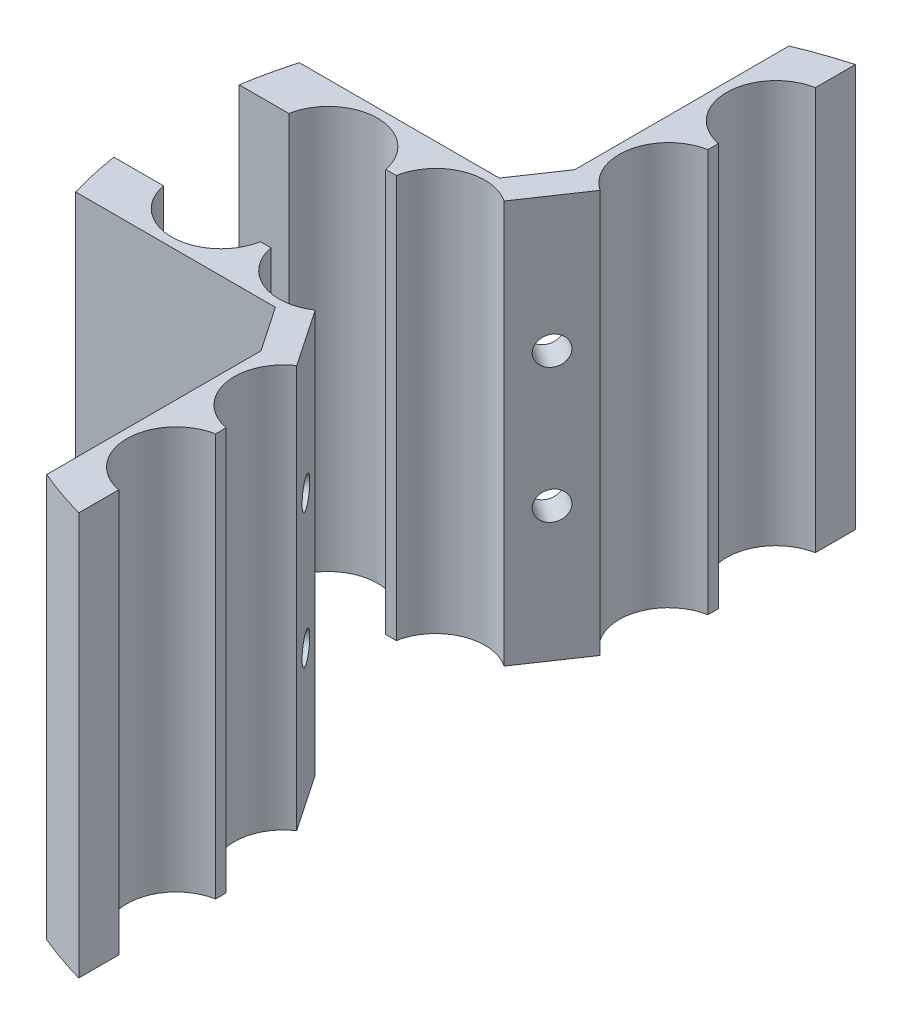
ISO-10303-21;
HEADER;
FILE_DESCRIPTION(('STEP AP214'),'2;1');
FILE_NAME('part.step','',(''),(''),'','','');
FILE_SCHEMA(('AUTOMOTIVE_DESIGN { 1 0 10303 214 1 1 1 1 }'));
ENDSEC;
DATA;
#1=APPLICATION_CONTEXT('core data for automotive mechanical design processes');
#2=APPLICATION_PROTOCOL_DEFINITION('international standard','automotive_design',2000,#1);
#3=PRODUCT_CONTEXT('',#1,'mechanical');
#4=PRODUCT('Part','Part','',(#3));
#5=PRODUCT_RELATED_PRODUCT_CATEGORY('part','',(#4));
#6=PRODUCT_DEFINITION_FORMATION('','',#4);
#7=PRODUCT_DEFINITION_CONTEXT('part definition',#1,'design');
#8=PRODUCT_DEFINITION('design','',#6,#7);
#9=PRODUCT_DEFINITION_SHAPE('','',#8);
#10=(LENGTH_UNIT() NAMED_UNIT(*) SI_UNIT(.MILLI.,.METRE.));
#11=(NAMED_UNIT(*) PLANE_ANGLE_UNIT() SI_UNIT($,.RADIAN.));
#12=(NAMED_UNIT(*) SI_UNIT($,.STERADIAN.) SOLID_ANGLE_UNIT());
#13=UNCERTAINTY_MEASURE_WITH_UNIT(LENGTH_MEASURE(1.E-05),#10,'distance_accuracy_value','');
#14=(GEOMETRIC_REPRESENTATION_CONTEXT(3) GLOBAL_UNCERTAINTY_ASSIGNED_CONTEXT((#13)) GLOBAL_UNIT_ASSIGNED_CONTEXT((#10,
#11,#12)) REPRESENTATION_CONTEXT('',''));
#15=CARTESIAN_POINT('',(0.,0.,0.));
#16=DIRECTION('',(0.,0.,1.));
#17=DIRECTION('',(1.,0.,0.));
#18=AXIS2_PLACEMENT_3D('',#15,#16,#17);
#19=CARTESIAN_POINT('',(0.,45.,0.));
#20=DIRECTION('',(0.,-1.,0.));
#21=DIRECTION('',(0.,0.,-1.));
#22=AXIS2_PLACEMENT_3D('',#19,#20,#21);
#23=CYLINDRICAL_SURFACE('',#22,45.);
#24=DIRECTION('',(0.,1.,0.));
#25=VECTOR('',#24,1.);
#26=CARTESIAN_POINT('',(-43.2290411644765,0.,12.5));
#27=LINE('',#26,#25);
#28=CARTESIAN_POINT('',(-43.2290411644765,0.,12.5));
#29=VERTEX_POINT('',#28);
#30=CARTESIAN_POINT('',(-43.2290411644765,45.,12.5));
#31=VERTEX_POINT('',#30);
#32=EDGE_CURVE('E199',#29,#31,#27,.T.);
#33=ORIENTED_EDGE('',*,*,#32,.T.);
#34=CARTESIAN_POINT('',(0.,45.,0.));
#35=DIRECTION('',(0.,1.,0.));
#36=DIRECTION('',(0.,0.,1.));
#37=AXIS2_PLACEMENT_3D('',#34,#35,#36);
#38=CIRCLE('',#37,45.);
#39=CARTESIAN_POINT('',(-44.4522215417857,45.,7.));
#40=VERTEX_POINT('',#39);
#41=EDGE_CURVE('E380',#40,#31,#38,.T.);
#42=ORIENTED_EDGE('',*,*,#41,.F.);
#43=DIRECTION('',(0.,-1.,0.));
#44=VECTOR('',#43,1.);
#45=CARTESIAN_POINT('',(-44.4522215417857,45.,6.99999999999999));
#46=LINE('',#45,#44);
#47=CARTESIAN_POINT('',(-44.4522215417857,0.,7.));
#48=VERTEX_POINT('',#47);
#49=EDGE_CURVE('E343',#48,#40,#46,.F.);
#50=ORIENTED_EDGE('',*,*,#49,.F.);
#51=CARTESIAN_POINT('',(0.,0.,0.));
#52=DIRECTION('',(0.,1.,0.));
#53=DIRECTION('',(0.,0.,1.));
#54=AXIS2_PLACEMENT_3D('',#51,#52,#53);
#55=CIRCLE('',#54,45.);
#56=EDGE_CURVE('E384',#48,#29,#55,.T.);
#57=ORIENTED_EDGE('',*,*,#56,.T.);
#58=EDGE_LOOP('',(#33,#42,#50,#57));
#59=FACE_BOUND('',#58,.T.);
#60=ADVANCED_FACE('F182',(#59),#23,.T.);
#61=CARTESIAN_POINT('',(0.,45.,0.));
#62=DIRECTION('',(0.,1.,0.));
#63=DIRECTION('',(0.,0.,1.));
#64=AXIS2_PLACEMENT_3D('',#61,#62,#63);
#65=PLANE('',#64);
#66=DIRECTION('',(0.56083647376651,0.,0.827926596802607));
#67=VECTOR('',#66,1.);
#68=CARTESIAN_POINT('',(-20.1360275526129,45.,13.6401206723948));
#69=LINE('',#68,#67);
#70=CARTESIAN_POINT('',(-20.9083439150097,45.,12.5));
#71=VERTEX_POINT('',#70);
#72=CARTESIAN_POINT('',(-17.5,45.,17.5315175818284));
#73=VERTEX_POINT('',#72);
#74=EDGE_CURVE('E299',#71,#73,#69,.T.);
#75=ORIENTED_EDGE('',*,*,#74,.T.);
#76=DIRECTION('',(0.,0.,1.));
#77=VECTOR('',#76,1.);
#78=CARTESIAN_POINT('',(-17.5,45.,0.));
#79=LINE('',#78,#77);
#80=CARTESIAN_POINT('',(-17.5,45.,41.4578098794425));
#81=VERTEX_POINT('',#80);
#82=EDGE_CURVE('E305',#73,#81,#79,.T.);
#83=ORIENTED_EDGE('',*,*,#82,.T.);
#84=CARTESIAN_POINT('',(-12.,45.,43.3704968844029));
#85=VERTEX_POINT('',#84);
#86=EDGE_CURVE('E383',#81,#85,#38,.T.);
#87=ORIENTED_EDGE('',*,*,#86,.T.);
#88=DIRECTION('',(0.,0.,1.));
#89=VECTOR('',#88,1.);
#90=CARTESIAN_POINT('',(-12.,45.,6.));
#91=LINE('',#90,#89);
#92=CARTESIAN_POINT('',(-12.,45.,38.908326913196));
#93=VERTEX_POINT('',#92);
#94=EDGE_CURVE('E334',#93,#85,#91,.T.);
#95=ORIENTED_EDGE('',*,*,#94,.F.);
#96=CARTESIAN_POINT('',(-11.,45.,33.5));
#97=DIRECTION('',(0.,1.,0.));
#98=DIRECTION('',(0.,0.,1.));
#99=AXIS2_PLACEMENT_3D('',#96,#97,#98);
#100=CIRCLE('',#99,5.5);
#101=CARTESIAN_POINT('',(-12.,45.,28.091673086804));
#102=VERTEX_POINT('',#101);
#103=EDGE_CURVE('E358',#102,#93,#100,.T.);
#104=ORIENTED_EDGE('',*,*,#103,.F.);
#105=CARTESIAN_POINT('',(-12.,45.,26.908326913196));
#106=VERTEX_POINT('',#105);
#107=EDGE_CURVE('E207',#106,#102,#91,.T.);
#108=ORIENTED_EDGE('',*,*,#107,.F.);
#109=CARTESIAN_POINT('',(-11.,45.,21.5));
#110=DIRECTION('',(0.,1.,0.));
#111=DIRECTION('',(0.,0.,1.));
#112=AXIS2_PLACEMENT_3D('',#109,#110,#111);
#113=CIRCLE('',#112,5.5);
#114=CARTESIAN_POINT('',(-14.0846647984323,45.,16.9464472023142));
#115=VERTEX_POINT('',#114);
#116=EDGE_CURVE('E355',#115,#106,#113,.T.);
#117=ORIENTED_EDGE('',*,*,#116,.F.);
#118=DIRECTION('',(0.560848145169515,0.,0.827918690488332));
#119=VECTOR('',#118,1.);
#120=CARTESIAN_POINT('',(-21.5,45.,6.));
#121=LINE('',#120,#119);
#122=CARTESIAN_POINT('',(-18.4153352015677,45.,10.5535527976858));
#123=VERTEX_POINT('',#122);
#124=EDGE_CURVE('E319',#123,#115,#121,.T.);
#125=ORIENTED_EDGE('',*,*,#124,.F.);
#126=CARTESIAN_POINT('',(-21.5,45.,6.));
#127=DIRECTION('',(0.,1.,0.));
#128=DIRECTION('',(0.,0.,1.));
#129=AXIS2_PLACEMENT_3D('',#126,#127,#128);
#130=CIRCLE('',#129,5.5);
#131=CARTESIAN_POINT('',(-26.908326913196,45.,7.));
#132=VERTEX_POINT('',#131);
#133=EDGE_CURVE('E364',#132,#123,#130,.T.);
#134=ORIENTED_EDGE('',*,*,#133,.F.);
#135=DIRECTION('',(-1.,0.,0.));
#136=VECTOR('',#135,1.);
#137=CARTESIAN_POINT('',(-11.,45.,7.));
#138=LINE('',#137,#136);
#139=CARTESIAN_POINT('',(-28.091673086804,45.,7.));
#140=VERTEX_POINT('',#139);
#141=EDGE_CURVE('E326',#132,#140,#138,.T.);
#142=ORIENTED_EDGE('',*,*,#141,.T.);
#143=CARTESIAN_POINT('',(-33.5,45.,6.));
#144=DIRECTION('',(0.,1.,0.));
#145=DIRECTION('',(0.,0.,1.));
#146=AXIS2_PLACEMENT_3D('',#143,#144,#145);
#147=CIRCLE('',#146,5.5);
#148=CARTESIAN_POINT('',(-38.908326913196,45.,7.));
#149=VERTEX_POINT('',#148);
#150=EDGE_CURVE('E367',#149,#140,#147,.T.);
#151=ORIENTED_EDGE('',*,*,#150,.F.);
#152=EDGE_CURVE('E327',#149,#40,#138,.T.);
#153=ORIENTED_EDGE('',*,*,#152,.T.);
#154=ORIENTED_EDGE('',*,*,#41,.T.);
#155=DIRECTION('',(1.,0.,0.));
#156=VECTOR('',#155,1.);
#157=CARTESIAN_POINT('',(0.,45.,12.5));
#158=LINE('',#157,#156);
#159=EDGE_CURVE('E308',#31,#71,#158,.T.);
#160=ORIENTED_EDGE('',*,*,#159,.T.);
#161=EDGE_LOOP('',(#75,#83,#87,#95,#104,#108,#117,#125,#134,#142,#151,#153,#154,#160));
#162=FACE_BOUND('',#161,.T.);
#163=ADVANCED_FACE('F432',(#162),#65,.T.);
#164=CARTESIAN_POINT('',(0.,0.,0.));
#165=DIRECTION('',(0.,1.,0.));
#166=DIRECTION('',(0.,0.,1.));
#167=AXIS2_PLACEMENT_3D('',#164,#165,#166);
#168=PLANE('',#167);
#169=DIRECTION('',(0.,0.,1.));
#170=VECTOR('',#169,1.);
#171=CARTESIAN_POINT('',(-17.5,0.,0.));
#172=LINE('',#171,#170);
#173=CARTESIAN_POINT('',(-17.5,0.,17.5315175818284));
#174=VERTEX_POINT('',#173);
#175=CARTESIAN_POINT('',(-17.5,0.,41.4578098794425));
#176=VERTEX_POINT('',#175);
#177=EDGE_CURVE('E291',#174,#176,#172,.T.);
#178=ORIENTED_EDGE('',*,*,#177,.F.);
#179=DIRECTION('',(0.56083647376651,0.,0.827926596802607));
#180=VECTOR('',#179,1.);
#181=CARTESIAN_POINT('',(-20.1360275526129,0.,13.6401206723948));
#182=LINE('',#181,#180);
#183=CARTESIAN_POINT('',(-20.9083439150097,0.,12.5));
#184=VERTEX_POINT('',#183);
#185=EDGE_CURVE('E292',#184,#174,#182,.T.);
#186=ORIENTED_EDGE('',*,*,#185,.F.);
#187=DIRECTION('',(1.,0.,0.));
#188=VECTOR('',#187,1.);
#189=CARTESIAN_POINT('',(0.,0.,12.5));
#190=LINE('',#189,#188);
#191=EDGE_CURVE('E282',#29,#184,#190,.T.);
#192=ORIENTED_EDGE('',*,*,#191,.F.);
#193=ORIENTED_EDGE('',*,*,#56,.F.);
#194=DIRECTION('',(-1.,0.,0.));
#195=VECTOR('',#194,1.);
#196=CARTESIAN_POINT('',(-11.,0.,7.));
#197=LINE('',#196,#195);
#198=CARTESIAN_POINT('',(-38.908326913196,0.,7.));
#199=VERTEX_POINT('',#198);
#200=EDGE_CURVE('E323',#199,#48,#197,.T.);
#201=ORIENTED_EDGE('',*,*,#200,.F.);
#202=CARTESIAN_POINT('',(-33.5,0.,6.));
#203=DIRECTION('',(0.,1.,0.));
#204=DIRECTION('',(0.,0.,1.));
#205=AXIS2_PLACEMENT_3D('',#202,#203,#204);
#206=CIRCLE('',#205,5.5);
#207=CARTESIAN_POINT('',(-28.091673086804,0.,7.));
#208=VERTEX_POINT('',#207);
#209=EDGE_CURVE('E370',#199,#208,#206,.T.);
#210=ORIENTED_EDGE('',*,*,#209,.T.);
#211=CARTESIAN_POINT('',(-26.908326913196,0.,7.));
#212=VERTEX_POINT('',#211);
#213=EDGE_CURVE('E325',#212,#208,#197,.T.);
#214=ORIENTED_EDGE('',*,*,#213,.F.);
#215=CARTESIAN_POINT('',(-21.5,0.,6.));
#216=DIRECTION('',(0.,1.,0.));
#217=DIRECTION('',(0.,0.,1.));
#218=AXIS2_PLACEMENT_3D('',#215,#216,#217);
#219=CIRCLE('',#218,5.5);
#220=CARTESIAN_POINT('',(-18.4153352015677,0.,10.5535527976858));
#221=VERTEX_POINT('',#220);
#222=EDGE_CURVE('E363',#212,#221,#219,.T.);
#223=ORIENTED_EDGE('',*,*,#222,.T.);
#224=DIRECTION('',(0.560848145169515,0.,0.827918690488332));
#225=VECTOR('',#224,1.);
#226=CARTESIAN_POINT('',(-21.5,0.,6.));
#227=LINE('',#226,#225);
#228=CARTESIAN_POINT('',(-14.0846647984323,0.,16.9464472023142));
#229=VERTEX_POINT('',#228);
#230=EDGE_CURVE('E337',#221,#229,#227,.T.);
#231=ORIENTED_EDGE('',*,*,#230,.T.);
#232=CARTESIAN_POINT('',(-11.,0.,21.5));
#233=DIRECTION('',(0.,1.,0.));
#234=DIRECTION('',(0.,0.,1.));
#235=AXIS2_PLACEMENT_3D('',#232,#233,#234);
#236=CIRCLE('',#235,5.5);
#237=CARTESIAN_POINT('',(-12.,0.,26.908326913196));
#238=VERTEX_POINT('',#237);
#239=EDGE_CURVE('E360',#229,#238,#236,.T.);
#240=ORIENTED_EDGE('',*,*,#239,.T.);
#241=DIRECTION('',(0.,0.,1.));
#242=VECTOR('',#241,1.);
#243=CARTESIAN_POINT('',(-12.,0.,6.));
#244=LINE('',#243,#242);
#245=CARTESIAN_POINT('',(-12.,0.,28.091673086804));
#246=VERTEX_POINT('',#245);
#247=EDGE_CURVE('E330',#238,#246,#244,.T.);
#248=ORIENTED_EDGE('',*,*,#247,.T.);
#249=CARTESIAN_POINT('',(-11.,0.,33.5));
#250=DIRECTION('',(0.,1.,0.));
#251=DIRECTION('',(0.,0.,1.));
#252=AXIS2_PLACEMENT_3D('',#249,#250,#251);
#253=CIRCLE('',#252,5.5);
#254=CARTESIAN_POINT('',(-12.,0.,38.908326913196));
#255=VERTEX_POINT('',#254);
#256=EDGE_CURVE('E359',#246,#255,#253,.T.);
#257=ORIENTED_EDGE('',*,*,#256,.T.);
#258=CARTESIAN_POINT('',(-12.,0.,43.3704968844029));
#259=VERTEX_POINT('',#258);
#260=EDGE_CURVE('E331',#255,#259,#244,.T.);
#261=ORIENTED_EDGE('',*,*,#260,.T.);
#262=EDGE_CURVE('E354',#176,#259,#55,.T.);
#263=ORIENTED_EDGE('',*,*,#262,.F.);
#264=EDGE_LOOP('',(#178,#186,#192,#193,#201,#210,#214,#223,#231,#240,#248,#257,#261,#263));
#265=FACE_BOUND('',#264,.T.);
#266=ADVANCED_FACE('F303',(#265),#168,.F.);
#267=ORIENTED_EDGE('',*,*,#86,.F.);
#268=DIRECTION('',(0.,1.,0.));
#269=VECTOR('',#268,1.);
#270=CARTESIAN_POINT('',(-17.5,0.,41.4578098794425));
#271=LINE('',#270,#269);
#272=EDGE_CURVE('E320',#176,#81,#271,.T.);
#273=ORIENTED_EDGE('',*,*,#272,.F.);
#274=ORIENTED_EDGE('',*,*,#262,.T.);
#275=DIRECTION('',(0.,-1.,0.));
#276=VECTOR('',#275,1.);
#277=CARTESIAN_POINT('',(-12.,45.,43.3704968844029));
#278=LINE('',#277,#276);
#279=EDGE_CURVE('E351',#259,#85,#278,.F.);
#280=ORIENTED_EDGE('',*,*,#279,.T.);
#281=EDGE_LOOP('',(#267,#273,#274,#280));
#282=FACE_BOUND('',#281,.T.);
#283=ADVANCED_FACE('F184',(#282),#23,.T.);
#284=CARTESIAN_POINT('',(-21.5,0.,6.));
#285=DIRECTION('',(0.,1.,0.));
#286=DIRECTION('',(0.,0.,1.));
#287=AXIS2_PLACEMENT_3D('',#284,#285,#286);
#288=CYLINDRICAL_SURFACE('',#287,5.5);
#289=DIRECTION('',(0.,1.,0.));
#290=VECTOR('',#289,1.);
#291=CARTESIAN_POINT('',(-26.908326913196,0.,7.));
#292=LINE('',#291,#290);
#293=EDGE_CURVE('E341',#132,#212,#292,.F.);
#294=ORIENTED_EDGE('',*,*,#293,.F.);
#295=ORIENTED_EDGE('',*,*,#133,.T.);
#296=DIRECTION('',(0.,1.,0.));
#297=VECTOR('',#296,1.);
#298=CARTESIAN_POINT('',(-18.4153352015677,0.,10.5535527976858));
#299=LINE('',#298,#297);
#300=EDGE_CURVE('E389',#123,#221,#299,.F.);
#301=ORIENTED_EDGE('',*,*,#300,.T.);
#302=ORIENTED_EDGE('',*,*,#222,.F.);
#303=EDGE_LOOP('',(#294,#295,#301,#302));
#304=FACE_BOUND('',#303,.T.);
#305=ADVANCED_FACE('F418',(#304),#288,.F.);
#306=CARTESIAN_POINT('',(-33.5,0.,6.));
#307=DIRECTION('',(0.,1.,0.));
#308=DIRECTION('',(0.,0.,1.));
#309=AXIS2_PLACEMENT_3D('',#306,#307,#308);
#310=CYLINDRICAL_SURFACE('',#309,5.5);
#311=DIRECTION('',(0.,1.,0.));
#312=VECTOR('',#311,1.);
#313=CARTESIAN_POINT('',(-38.908326913196,0.,7.));
#314=LINE('',#313,#312);
#315=EDGE_CURVE('E387',#149,#199,#314,.F.);
#316=ORIENTED_EDGE('',*,*,#315,.F.);
#317=ORIENTED_EDGE('',*,*,#150,.T.);
#318=DIRECTION('',(0.,1.,0.));
#319=VECTOR('',#318,1.);
#320=CARTESIAN_POINT('',(-28.091673086804,0.,7.));
#321=LINE('',#320,#319);
#322=EDGE_CURVE('E377',#208,#140,#321,.T.);
#323=ORIENTED_EDGE('',*,*,#322,.F.);
#324=ORIENTED_EDGE('',*,*,#209,.F.);
#325=EDGE_LOOP('',(#316,#317,#323,#324));
#326=FACE_BOUND('',#325,.T.);
#327=ADVANCED_FACE('F429',(#326),#310,.F.);
#328=CARTESIAN_POINT('',(-11.,0.,21.5));
#329=DIRECTION('',(0.,1.,0.));
#330=DIRECTION('',(0.,0.,1.));
#331=AXIS2_PLACEMENT_3D('',#328,#329,#330);
#332=CYLINDRICAL_SURFACE('',#331,5.5);
#333=ORIENTED_EDGE('',*,*,#116,.T.);
#334=DIRECTION('',(0.,1.,0.));
#335=VECTOR('',#334,1.);
#336=CARTESIAN_POINT('',(-12.,0.,26.908326913196));
#337=LINE('',#336,#335);
#338=EDGE_CURVE('E348',#106,#238,#337,.F.);
#339=ORIENTED_EDGE('',*,*,#338,.T.);
#340=ORIENTED_EDGE('',*,*,#239,.F.);
#341=DIRECTION('',(0.,1.,0.));
#342=VECTOR('',#341,1.);
#343=CARTESIAN_POINT('',(-14.0846647984323,0.,16.9464472023142));
#344=LINE('',#343,#342);
#345=EDGE_CURVE('E345',#229,#115,#344,.T.);
#346=ORIENTED_EDGE('',*,*,#345,.T.);
#347=EDGE_LOOP('',(#333,#339,#340,#346));
#348=FACE_BOUND('',#347,.T.);
#349=ADVANCED_FACE('F436',(#348),#332,.F.);
#350=CARTESIAN_POINT('',(-11.,0.,33.5));
#351=DIRECTION('',(0.,1.,0.));
#352=DIRECTION('',(0.,0.,1.));
#353=AXIS2_PLACEMENT_3D('',#350,#351,#352);
#354=CYLINDRICAL_SURFACE('',#353,5.5);
#355=ORIENTED_EDGE('',*,*,#103,.T.);
#356=DIRECTION('',(0.,1.,0.));
#357=VECTOR('',#356,1.);
#358=CARTESIAN_POINT('',(-12.,0.,38.908326913196));
#359=LINE('',#358,#357);
#360=EDGE_CURVE('E13',#93,#255,#359,.F.);
#361=ORIENTED_EDGE('',*,*,#360,.T.);
#362=ORIENTED_EDGE('',*,*,#256,.F.);
#363=DIRECTION('',(0.,1.,0.));
#364=VECTOR('',#363,1.);
#365=CARTESIAN_POINT('',(-12.,0.,28.091673086804));
#366=LINE('',#365,#364);
#367=EDGE_CURVE('E191',#246,#102,#366,.T.);
#368=ORIENTED_EDGE('',*,*,#367,.T.);
#369=EDGE_LOOP('',(#355,#361,#362,#368));
#370=FACE_BOUND('',#369,.T.);
#371=ADVANCED_FACE('F440',(#370),#354,.F.);
#372=CARTESIAN_POINT('',(-11.,0.,7.));
#373=DIRECTION('',(0.,0.,-1.));
#374=DIRECTION('',(-1.,0.,0.));
#375=AXIS2_PLACEMENT_3D('',#372,#373,#374);
#376=PLANE('',#375);
#377=ORIENTED_EDGE('',*,*,#293,.T.);
#378=ORIENTED_EDGE('',*,*,#213,.T.);
#379=ORIENTED_EDGE('',*,*,#322,.T.);
#380=ORIENTED_EDGE('',*,*,#141,.F.);
#381=EDGE_LOOP('',(#377,#378,#379,#380));
#382=FACE_BOUND('',#381,.T.);
#383=ADVANCED_FACE('F425',(#382),#376,.T.);
#384=ORIENTED_EDGE('',*,*,#49,.T.);
#385=ORIENTED_EDGE('',*,*,#152,.F.);
#386=ORIENTED_EDGE('',*,*,#315,.T.);
#387=ORIENTED_EDGE('',*,*,#200,.T.);
#388=EDGE_LOOP('',(#384,#385,#386,#387));
#389=FACE_BOUND('',#388,.T.);
#390=ADVANCED_FACE('F410',(#389),#376,.T.);
#391=CARTESIAN_POINT('',(-21.5,0.,6.));
#392=DIRECTION('',(-0.827918690488332,0.,0.560848145169515));
#393=DIRECTION('',(0.560848145169515,0.,0.827918690488332));
#394=AXIS2_PLACEMENT_3D('',#391,#392,#393);
#395=PLANE('',#394);
#396=CARTESIAN_POINT('',(-16.25,30.,13.75));
#397=DIRECTION('',(0.827918690488332,0.,-0.560848145169515));
#398=DIRECTION('',(-0.560848145169515,0.,-0.827918690488332));
#399=AXIS2_PLACEMENT_3D('',#396,#397,#398);
#400=CIRCLE('',#399,1.6);
#401=CARTESIAN_POINT('',(-17.1473570322712,30.,12.4253300952187));
#402=VERTEX_POINT('',#401);
#403=EDGE_CURVE('E394',#402,#402,#400,.T.);
#404=ORIENTED_EDGE('',*,*,#403,.F.);
#405=EDGE_LOOP('',(#404));
#406=FACE_BOUND('',#405,.T.);
#407=CARTESIAN_POINT('',(-16.25,15.,13.75));
#408=DIRECTION('',(0.827918690488332,0.,-0.560848145169515));
#409=DIRECTION('',(-0.560848145169515,0.,-0.827918690488332));
#410=AXIS2_PLACEMENT_3D('',#407,#408,#409);
#411=CIRCLE('',#410,1.6);
#412=CARTESIAN_POINT('',(-17.1473570322712,15.,12.4253300952187));
#413=VERTEX_POINT('',#412);
#414=EDGE_CURVE('E311',#413,#413,#411,.T.);
#415=ORIENTED_EDGE('',*,*,#414,.F.);
#416=EDGE_LOOP('',(#415));
#417=FACE_BOUND('',#416,.T.);
#418=ORIENTED_EDGE('',*,*,#230,.F.);
#419=ORIENTED_EDGE('',*,*,#300,.F.);
#420=ORIENTED_EDGE('',*,*,#124,.T.);
#421=ORIENTED_EDGE('',*,*,#345,.F.);
#422=EDGE_LOOP('',(#418,#419,#420,#421));
#423=FACE_BOUND('',#422,.T.);
#424=ADVANCED_FACE('F406',(#406,#417,#423),#395,.F.);
#425=CARTESIAN_POINT('',(-12.,0.,6.));
#426=DIRECTION('',(-1.,0.,0.));
#427=DIRECTION('',(0.,0.,1.));
#428=AXIS2_PLACEMENT_3D('',#425,#426,#427);
#429=PLANE('',#428);
#430=ORIENTED_EDGE('',*,*,#107,.T.);
#431=ORIENTED_EDGE('',*,*,#367,.F.);
#432=ORIENTED_EDGE('',*,*,#247,.F.);
#433=ORIENTED_EDGE('',*,*,#338,.F.);
#434=EDGE_LOOP('',(#430,#431,#432,#433));
#435=FACE_BOUND('',#434,.T.);
#436=ADVANCED_FACE('F409',(#435),#429,.F.);
#437=ORIENTED_EDGE('',*,*,#260,.F.);
#438=ORIENTED_EDGE('',*,*,#360,.F.);
#439=ORIENTED_EDGE('',*,*,#94,.T.);
#440=ORIENTED_EDGE('',*,*,#279,.F.);
#441=EDGE_LOOP('',(#437,#438,#439,#440));
#442=FACE_BOUND('',#441,.T.);
#443=ADVANCED_FACE('F444',(#442),#429,.F.);
#444=CARTESIAN_POINT('',(-20.1360275526129,0.,13.6401206723948));
#445=DIRECTION('',(-0.827926596802607,0.,0.56083647376651));
#446=DIRECTION('',(0.56083647376651,0.,0.827926596802607));
#447=AXIS2_PLACEMENT_3D('',#444,#445,#446);
#448=PLANE('',#447);
#449=CARTESIAN_POINT('',(-18.8626805902712,30.,15.5198803998611));
#450=DIRECTION('',(-0.827926596802607,0.,0.56083647376651));
#451=DIRECTION('',(-0.56083647376651,0.,-0.827926596802607));
#452=AXIS2_PLACEMENT_3D('',#449,#450,#451);
#453=ELLIPSE('',#452,1.60000000015899,1.6);
#454=CARTESIAN_POINT('',(-19.7600189483867,30.,14.1951978448453));
#455=VERTEX_POINT('',#454);
#456=EDGE_CURVE('E186',#455,#455,#453,.T.);
#457=ORIENTED_EDGE('',*,*,#456,.F.);
#458=EDGE_LOOP('',(#457));
#459=FACE_BOUND('',#458,.T.);
#460=CARTESIAN_POINT('',(-18.8626805902712,15.,15.5198803998611));
#461=DIRECTION('',(-0.827926596802607,0.,0.56083647376651));
#462=DIRECTION('',(-0.56083647376651,0.,-0.827926596802607));
#463=AXIS2_PLACEMENT_3D('',#460,#461,#462);
#464=ELLIPSE('',#463,1.60000000015899,1.6);
#465=CARTESIAN_POINT('',(-19.7600189483867,15.,14.1951978448453));
#466=VERTEX_POINT('',#465);
#467=EDGE_CURVE('E392',#466,#466,#464,.T.);
#468=ORIENTED_EDGE('',*,*,#467,.F.);
#469=EDGE_LOOP('',(#468));
#470=FACE_BOUND('',#469,.T.);
#471=ORIENTED_EDGE('',*,*,#74,.F.);
#472=DIRECTION('',(0.,1.,0.));
#473=VECTOR('',#472,1.);
#474=CARTESIAN_POINT('',(-20.9083439150097,0.,12.5));
#475=LINE('',#474,#473);
#476=EDGE_CURVE('E285',#184,#71,#475,.T.);
#477=ORIENTED_EDGE('',*,*,#476,.F.);
#478=ORIENTED_EDGE('',*,*,#185,.T.);
#479=DIRECTION('',(0.,1.,0.));
#480=VECTOR('',#479,1.);
#481=CARTESIAN_POINT('',(-17.5,0.,17.5315175818284));
#482=LINE('',#481,#480);
#483=EDGE_CURVE('E317',#174,#73,#482,.T.);
#484=ORIENTED_EDGE('',*,*,#483,.T.);
#485=EDGE_LOOP('',(#471,#477,#478,#484));
#486=FACE_BOUND('',#485,.T.);
#487=ADVANCED_FACE('F295',(#459,#470,#486),#448,.T.);
#488=CARTESIAN_POINT('',(-17.5,0.,0.));
#489=DIRECTION('',(-1.,0.,0.));
#490=DIRECTION('',(0.,0.,1.));
#491=AXIS2_PLACEMENT_3D('',#488,#489,#490);
#492=PLANE('',#491);
#493=ORIENTED_EDGE('',*,*,#82,.F.);
#494=ORIENTED_EDGE('',*,*,#483,.F.);
#495=ORIENTED_EDGE('',*,*,#177,.T.);
#496=ORIENTED_EDGE('',*,*,#272,.T.);
#497=EDGE_LOOP('',(#493,#494,#495,#496));
#498=FACE_BOUND('',#497,.T.);
#499=ADVANCED_FACE('F450',(#498),#492,.T.);
#500=CARTESIAN_POINT('',(0.,0.,12.5));
#501=DIRECTION('',(0.,0.,1.));
#502=DIRECTION('',(1.,0.,0.));
#503=AXIS2_PLACEMENT_3D('',#500,#501,#502);
#504=PLANE('',#503);
#505=ORIENTED_EDGE('',*,*,#159,.F.);
#506=ORIENTED_EDGE('',*,*,#32,.F.);
#507=ORIENTED_EDGE('',*,*,#191,.T.);
#508=ORIENTED_EDGE('',*,*,#476,.T.);
#509=EDGE_LOOP('',(#505,#506,#507,#508));
#510=FACE_BOUND('',#509,.T.);
#511=ADVANCED_FACE('F284',(#510),#504,.T.);
#512=CARTESIAN_POINT('',(-53.5063410719749,15.,38.9881665326282));
#513=DIRECTION('',(0.827918690488332,0.,-0.560848145169515));
#514=DIRECTION('',(-0.560848145169515,0.,-0.827918690488332));
#515=AXIS2_PLACEMENT_3D('',#512,#513,#514);
#516=CYLINDRICAL_SURFACE('',#515,1.6);
#517=ORIENTED_EDGE('',*,*,#467,.T.);
#518=EDGE_LOOP('',(#517));
#519=FACE_BOUND('',#518,.T.);
#520=ORIENTED_EDGE('',*,*,#414,.T.);
#521=EDGE_LOOP('',(#520));
#522=FACE_BOUND('',#521,.T.);
#523=ADVANCED_FACE('F404',(#519,#522),#516,.F.);
#524=CARTESIAN_POINT('',(-53.5063410719749,30.,38.9881665326282));
#525=DIRECTION('',(0.827918690488332,0.,-0.560848145169515));
#526=DIRECTION('',(-0.560848145169515,0.,-0.827918690488332));
#527=AXIS2_PLACEMENT_3D('',#524,#525,#526);
#528=CYLINDRICAL_SURFACE('',#527,1.6);
#529=ORIENTED_EDGE('',*,*,#456,.T.);
#530=EDGE_LOOP('',(#529));
#531=FACE_BOUND('',#530,.T.);
#532=ORIENTED_EDGE('',*,*,#403,.T.);
#533=EDGE_LOOP('',(#532));
#534=FACE_BOUND('',#533,.T.);
#535=ADVANCED_FACE('F518',(#531,#534),#528,.F.);
#536=CLOSED_SHELL('',(#60,#163,#266,#283,#305,#327,#349,#371,#383,#390,#424,#436,#443,#487,#499,
#511,#523,#535));
#537=MANIFOLD_SOLID_BREP('B2',#536);
#538=CARTESIAN_POINT('',(0.,45.,0.));
#539=DIRECTION('',(0.,-1.,0.));
#540=DIRECTION('',(0.,0.,-1.));
#541=AXIS2_PLACEMENT_3D('',#538,#539,#540);
#542=CYLINDRICAL_SURFACE('',#541,45.);
#543=DIRECTION('',(0.,1.,0.));
#544=VECTOR('',#543,1.);
#545=CARTESIAN_POINT('',(-43.2290411644765,0.,-12.5));
#546=LINE('',#545,#544);
#547=CARTESIAN_POINT('',(-43.2290411644765,0.,-12.5));
#548=VERTEX_POINT('',#547);
#549=CARTESIAN_POINT('',(-43.2290411644765,45.,-12.5));
#550=VERTEX_POINT('',#549);
#551=EDGE_CURVE('E742',#548,#550,#546,.T.);
#552=ORIENTED_EDGE('',*,*,#551,.F.);
#553=CARTESIAN_POINT('',(0.,0.,0.));
#554=DIRECTION('',(0.,1.,0.));
#555=DIRECTION('',(0.,0.,1.));
#556=AXIS2_PLACEMENT_3D('',#553,#554,#555);
#557=CIRCLE('',#556,45.);
#558=CARTESIAN_POINT('',(-44.4522215417857,0.,-7.));
#559=VERTEX_POINT('',#558);
#560=EDGE_CURVE('E731',#548,#559,#557,.T.);
#561=ORIENTED_EDGE('',*,*,#560,.T.);
#562=DIRECTION('',(0.,-1.,0.));
#563=VECTOR('',#562,1.);
#564=CARTESIAN_POINT('',(-44.4522215417857,45.,-6.99999999999999));
#565=LINE('',#564,#563);
#566=CARTESIAN_POINT('',(-44.4522215417857,45.,-7.));
#567=VERTEX_POINT('',#566);
#568=EDGE_CURVE('E615',#559,#567,#565,.F.);
#569=ORIENTED_EDGE('',*,*,#568,.T.);
#570=CARTESIAN_POINT('',(0.,45.,0.));
#571=DIRECTION('',(0.,1.,0.));
#572=DIRECTION('',(0.,0.,1.));
#573=AXIS2_PLACEMENT_3D('',#570,#571,#572);
#574=CIRCLE('',#573,45.);
#575=EDGE_CURVE('E810',#550,#567,#574,.T.);
#576=ORIENTED_EDGE('',*,*,#575,.F.);
#577=EDGE_LOOP('',(#552,#561,#569,#576));
#578=FACE_BOUND('',#577,.T.);
#579=ADVANCED_FACE('F607',(#578),#542,.T.);
#580=DIRECTION('',(0.,1.,0.));
#581=VECTOR('',#580,1.);
#582=CARTESIAN_POINT('',(-17.5,0.,-41.4578098794425));
#583=LINE('',#582,#581);
#584=CARTESIAN_POINT('',(-17.5,0.,-41.4578098794425));
#585=VERTEX_POINT('',#584);
#586=CARTESIAN_POINT('',(-17.5,45.,-41.4578098794425));
#587=VERTEX_POINT('',#586);
#588=EDGE_CURVE('E745',#585,#587,#583,.T.);
#589=ORIENTED_EDGE('',*,*,#588,.T.);
#590=CARTESIAN_POINT('',(-12.,45.,-43.3704968844029));
#591=VERTEX_POINT('',#590);
#592=EDGE_CURVE('E807',#591,#587,#574,.T.);
#593=ORIENTED_EDGE('',*,*,#592,.F.);
#594=DIRECTION('',(0.,-1.,0.));
#595=VECTOR('',#594,1.);
#596=CARTESIAN_POINT('',(-12.,45.,-43.3704968844029));
#597=LINE('',#596,#595);
#598=CARTESIAN_POINT('',(-12.,0.,-43.3704968844029));
#599=VERTEX_POINT('',#598);
#600=EDGE_CURVE('E180',#599,#591,#597,.F.);
#601=ORIENTED_EDGE('',*,*,#600,.F.);
#602=EDGE_CURVE('E811',#599,#585,#557,.T.);
#603=ORIENTED_EDGE('',*,*,#602,.T.);
#604=EDGE_LOOP('',(#589,#593,#601,#603));
#605=FACE_BOUND('',#604,.T.);
#606=ADVANCED_FACE('F864',(#605),#542,.T.);
#607=CARTESIAN_POINT('',(-11.,0.,-33.5));
#608=DIRECTION('',(0.,1.,0.));
#609=DIRECTION('',(0.,0.,1.));
#610=AXIS2_PLACEMENT_3D('',#607,#608,#609);
#611=CYLINDRICAL_SURFACE('',#610,5.5);
#612=DIRECTION('',(0.,1.,0.));
#613=VECTOR('',#612,1.);
#614=CARTESIAN_POINT('',(-12.,0.,-38.908326913196));
#615=LINE('',#614,#613);
#616=CARTESIAN_POINT('',(-12.,45.,-38.908326913196));
#617=VERTEX_POINT('',#616);
#618=CARTESIAN_POINT('',(-12.,0.,-38.908326913196));
#619=VERTEX_POINT('',#618);
#620=EDGE_CURVE('E777',#617,#619,#615,.F.);
#621=ORIENTED_EDGE('',*,*,#620,.F.);
#622=CARTESIAN_POINT('',(-11.,45.,-33.5));
#623=DIRECTION('',(0.,1.,0.));
#624=DIRECTION('',(0.,0.,-1.));
#625=AXIS2_PLACEMENT_3D('',#622,#623,#624);
#626=CIRCLE('',#625,5.5);
#627=CARTESIAN_POINT('',(-12.,45.,-28.091673086804));
#628=VERTEX_POINT('',#627);
#629=EDGE_CURVE('E787',#617,#628,#626,.T.);
#630=ORIENTED_EDGE('',*,*,#629,.T.);
#631=DIRECTION('',(0.,1.,0.));
#632=VECTOR('',#631,1.);
#633=CARTESIAN_POINT('',(-12.,0.,-28.091673086804));
#634=LINE('',#633,#632);
#635=CARTESIAN_POINT('',(-12.,0.,-28.091673086804));
#636=VERTEX_POINT('',#635);
#637=EDGE_CURVE('E775',#636,#628,#634,.T.);
#638=ORIENTED_EDGE('',*,*,#637,.F.);
#639=CARTESIAN_POINT('',(-11.,0.,-33.5));
#640=DIRECTION('',(0.,1.,0.));
#641=DIRECTION('',(0.,0.,-1.));
#642=AXIS2_PLACEMENT_3D('',#639,#640,#641);
#643=CIRCLE('',#642,5.5);
#644=EDGE_CURVE('E802',#619,#636,#643,.T.);
#645=ORIENTED_EDGE('',*,*,#644,.F.);
#646=EDGE_LOOP('',(#621,#630,#638,#645));
#647=FACE_BOUND('',#646,.T.);
#648=ADVANCED_FACE('F873',(#647),#611,.F.);
#649=CARTESIAN_POINT('',(-21.5,0.,-6.));
#650=DIRECTION('',(0.,1.,0.));
#651=DIRECTION('',(0.,0.,1.));
#652=AXIS2_PLACEMENT_3D('',#649,#650,#651);
#653=CYLINDRICAL_SURFACE('',#652,5.5);
#654=CARTESIAN_POINT('',(-21.5,45.,-6.));
#655=DIRECTION('',(0.,1.,0.));
#656=DIRECTION('',(0.,0.,-1.));
#657=AXIS2_PLACEMENT_3D('',#654,#655,#656);
#658=CIRCLE('',#657,5.5);
#659=CARTESIAN_POINT('',(-18.4153352015677,45.,-10.5535527976858));
#660=VERTEX_POINT('',#659);
#661=CARTESIAN_POINT('',(-26.908326913196,45.,-7.));
#662=VERTEX_POINT('',#661);
#663=EDGE_CURVE('E794',#660,#662,#658,.T.);
#664=ORIENTED_EDGE('',*,*,#663,.T.);
#665=DIRECTION('',(0.,1.,0.));
#666=VECTOR('',#665,1.);
#667=CARTESIAN_POINT('',(-26.908326913196,0.,-7.));
#668=LINE('',#667,#666);
#669=CARTESIAN_POINT('',(-26.908326913196,0.,-7.));
#670=VERTEX_POINT('',#669);
#671=EDGE_CURVE('E631',#662,#670,#668,.F.);
#672=ORIENTED_EDGE('',*,*,#671,.T.);
#673=CARTESIAN_POINT('',(-21.5,0.,-6.));
#674=DIRECTION('',(0.,1.,0.));
#675=DIRECTION('',(0.,0.,-1.));
#676=AXIS2_PLACEMENT_3D('',#673,#674,#675);
#677=CIRCLE('',#676,5.5);
#678=CARTESIAN_POINT('',(-18.4153352015677,0.,-10.5535527976858));
#679=VERTEX_POINT('',#678);
#680=EDGE_CURVE('E791',#679,#670,#677,.T.);
#681=ORIENTED_EDGE('',*,*,#680,.F.);
#682=DIRECTION('',(0.,1.,0.));
#683=VECTOR('',#682,1.);
#684=CARTESIAN_POINT('',(-18.4153352015677,0.,-10.5535527976858));
#685=LINE('',#684,#683);
#686=EDGE_CURVE('E781',#660,#679,#685,.F.);
#687=ORIENTED_EDGE('',*,*,#686,.F.);
#688=EDGE_LOOP('',(#664,#672,#681,#687));
#689=FACE_BOUND('',#688,.T.);
#690=ADVANCED_FACE('F846',(#689),#653,.F.);
#691=CARTESIAN_POINT('',(-11.,0.,-21.5));
#692=DIRECTION('',(0.,1.,0.));
#693=DIRECTION('',(0.,0.,1.));
#694=AXIS2_PLACEMENT_3D('',#691,#692,#693);
#695=CYLINDRICAL_SURFACE('',#694,5.5);
#696=DIRECTION('',(0.,1.,0.));
#697=VECTOR('',#696,1.);
#698=CARTESIAN_POINT('',(-12.,0.,-26.908326913196));
#699=LINE('',#698,#697);
#700=CARTESIAN_POINT('',(-12.,45.,-26.908326913196));
#701=VERTEX_POINT('',#700);
#702=CARTESIAN_POINT('',(-12.,0.,-26.908326913196));
#703=VERTEX_POINT('',#702);
#704=EDGE_CURVE('E773',#701,#703,#699,.F.);
#705=ORIENTED_EDGE('',*,*,#704,.F.);
#706=CARTESIAN_POINT('',(-11.,45.,-21.5));
#707=DIRECTION('',(0.,1.,0.));
#708=DIRECTION('',(0.,0.,-1.));
#709=AXIS2_PLACEMENT_3D('',#706,#707,#708);
#710=CIRCLE('',#709,5.5);
#711=CARTESIAN_POINT('',(-14.0846647984323,45.,-16.9464472023142));
#712=VERTEX_POINT('',#711);
#713=EDGE_CURVE('E788',#701,#712,#710,.T.);
#714=ORIENTED_EDGE('',*,*,#713,.T.);
#715=DIRECTION('',(0.,1.,0.));
#716=VECTOR('',#715,1.);
#717=CARTESIAN_POINT('',(-14.0846647984323,0.,-16.9464472023142));
#718=LINE('',#717,#716);
#719=CARTESIAN_POINT('',(-14.0846647984323,0.,-16.9464472023142));
#720=VERTEX_POINT('',#719);
#721=EDGE_CURVE('E779',#720,#712,#718,.T.);
#722=ORIENTED_EDGE('',*,*,#721,.F.);
#723=CARTESIAN_POINT('',(-11.,0.,-21.5));
#724=DIRECTION('',(0.,1.,0.));
#725=DIRECTION('',(0.,0.,-1.));
#726=AXIS2_PLACEMENT_3D('',#723,#724,#725);
#727=CIRCLE('',#726,5.5);
#728=EDGE_CURVE('E784',#703,#720,#727,.T.);
#729=ORIENTED_EDGE('',*,*,#728,.F.);
#730=EDGE_LOOP('',(#705,#714,#722,#729));
#731=FACE_BOUND('',#730,.T.);
#732=ADVANCED_FACE('F879',(#731),#695,.F.);
#733=CARTESIAN_POINT('',(0.,0.,0.));
#734=DIRECTION('',(0.,1.,0.));
#735=DIRECTION('',(0.,0.,1.));
#736=AXIS2_PLACEMENT_3D('',#733,#734,#735);
#737=PLANE('',#736);
#738=ORIENTED_EDGE('',*,*,#560,.F.);
#739=DIRECTION('',(1.,0.,0.));
#740=VECTOR('',#739,1.);
#741=CARTESIAN_POINT('',(0.,0.,-12.5));
#742=LINE('',#741,#740);
#743=CARTESIAN_POINT('',(-20.9083439150097,0.,-12.5));
#744=VERTEX_POINT('',#743);
#745=EDGE_CURVE('E711',#548,#744,#742,.T.);
#746=ORIENTED_EDGE('',*,*,#745,.T.);
#747=DIRECTION('',(0.56083647376651,0.,-0.827926596802607));
#748=VECTOR('',#747,1.);
#749=CARTESIAN_POINT('',(-20.1360275526129,0.,-13.6401206723948));
#750=LINE('',#749,#748);
#751=CARTESIAN_POINT('',(-17.5,0.,-17.5315175818284));
#752=VERTEX_POINT('',#751);
#753=EDGE_CURVE('E723',#744,#752,#750,.T.);
#754=ORIENTED_EDGE('',*,*,#753,.T.);
#755=DIRECTION('',(0.,0.,1.));
#756=VECTOR('',#755,1.);
#757=CARTESIAN_POINT('',(-17.5,0.,0.));
#758=LINE('',#757,#756);
#759=EDGE_CURVE('E719',#585,#752,#758,.T.);
#760=ORIENTED_EDGE('',*,*,#759,.F.);
#761=ORIENTED_EDGE('',*,*,#602,.F.);
#762=DIRECTION('',(0.,0.,-1.));
#763=VECTOR('',#762,1.);
#764=CARTESIAN_POINT('',(-12.,0.,-6.));
#765=LINE('',#764,#763);
#766=EDGE_CURVE('E744',#619,#599,#765,.T.);
#767=ORIENTED_EDGE('',*,*,#766,.F.);
#768=ORIENTED_EDGE('',*,*,#644,.T.);
#769=EDGE_CURVE('E764',#703,#636,#765,.T.);
#770=ORIENTED_EDGE('',*,*,#769,.F.);
#771=ORIENTED_EDGE('',*,*,#728,.T.);
#772=DIRECTION('',(0.560848145169515,0.,-0.827918690488332));
#773=VECTOR('',#772,1.);
#774=CARTESIAN_POINT('',(-21.5,0.,-6.));
#775=LINE('',#774,#773);
#776=EDGE_CURVE('E758',#679,#720,#775,.T.);
#777=ORIENTED_EDGE('',*,*,#776,.F.);
#778=ORIENTED_EDGE('',*,*,#680,.T.);
#779=DIRECTION('',(-1.,0.,0.));
#780=VECTOR('',#779,1.);
#781=CARTESIAN_POINT('',(-11.,0.,-7.));
#782=LINE('',#781,#780);
#783=CARTESIAN_POINT('',(-28.091673086804,0.,-7.));
#784=VERTEX_POINT('',#783);
#785=EDGE_CURVE('E752',#670,#784,#782,.T.);
#786=ORIENTED_EDGE('',*,*,#785,.T.);
#787=CARTESIAN_POINT('',(-33.5,0.,-6.));
#788=DIRECTION('',(0.,1.,0.));
#789=DIRECTION('',(0.,0.,-1.));
#790=AXIS2_PLACEMENT_3D('',#787,#788,#789);
#791=CIRCLE('',#790,5.5);
#792=CARTESIAN_POINT('',(-38.908326913196,0.,-7.));
#793=VERTEX_POINT('',#792);
#794=EDGE_CURVE('E797',#784,#793,#791,.T.);
#795=ORIENTED_EDGE('',*,*,#794,.T.);
#796=EDGE_CURVE('E753',#793,#559,#782,.T.);
#797=ORIENTED_EDGE('',*,*,#796,.T.);
#798=EDGE_LOOP('',(#738,#746,#754,#760,#761,#767,#768,#770,#771,#777,#778,#786,#795,#797));
#799=FACE_BOUND('',#798,.T.);
#800=ADVANCED_FACE('F729',(#799),#737,.F.);
#801=CARTESIAN_POINT('',(0.,45.,0.));
#802=DIRECTION('',(0.,1.,0.));
#803=DIRECTION('',(0.,0.,1.));
#804=AXIS2_PLACEMENT_3D('',#801,#802,#803);
#805=PLANE('',#804);
#806=DIRECTION('',(1.,0.,0.));
#807=VECTOR('',#806,1.);
#808=CARTESIAN_POINT('',(0.,45.,-12.5));
#809=LINE('',#808,#807);
#810=CARTESIAN_POINT('',(-20.9083439150097,45.,-12.5));
#811=VERTEX_POINT('',#810);
#812=EDGE_CURVE('E714',#550,#811,#809,.T.);
#813=ORIENTED_EDGE('',*,*,#812,.F.);
#814=ORIENTED_EDGE('',*,*,#575,.T.);
#815=DIRECTION('',(-1.,0.,0.));
#816=VECTOR('',#815,1.);
#817=CARTESIAN_POINT('',(-11.,45.,-7.));
#818=LINE('',#817,#816);
#819=CARTESIAN_POINT('',(-38.908326913196,45.,-7.));
#820=VERTEX_POINT('',#819);
#821=EDGE_CURVE('E748',#820,#567,#818,.T.);
#822=ORIENTED_EDGE('',*,*,#821,.F.);
#823=CARTESIAN_POINT('',(-33.5,45.,-6.));
#824=DIRECTION('',(0.,1.,0.));
#825=DIRECTION('',(0.,0.,-1.));
#826=AXIS2_PLACEMENT_3D('',#823,#824,#825);
#827=CIRCLE('',#826,5.5);
#828=CARTESIAN_POINT('',(-28.091673086804,45.,-7.));
#829=VERTEX_POINT('',#828);
#830=EDGE_CURVE('E783',#829,#820,#827,.T.);
#831=ORIENTED_EDGE('',*,*,#830,.F.);
#832=EDGE_CURVE('E751',#662,#829,#818,.T.);
#833=ORIENTED_EDGE('',*,*,#832,.F.);
#834=ORIENTED_EDGE('',*,*,#663,.F.);
#835=DIRECTION('',(0.560848145169515,0.,-0.827918690488332));
#836=VECTOR('',#835,1.);
#837=CARTESIAN_POINT('',(-21.5,45.,-6.));
#838=LINE('',#837,#836);
#839=EDGE_CURVE('E755',#660,#712,#838,.T.);
#840=ORIENTED_EDGE('',*,*,#839,.T.);
#841=ORIENTED_EDGE('',*,*,#713,.F.);
#842=DIRECTION('',(0.,0.,-1.));
#843=VECTOR('',#842,1.);
#844=CARTESIAN_POINT('',(-12.,45.,-6.));
#845=LINE('',#844,#843);
#846=EDGE_CURVE('E760',#701,#628,#845,.T.);
#847=ORIENTED_EDGE('',*,*,#846,.T.);
#848=ORIENTED_EDGE('',*,*,#629,.F.);
#849=EDGE_CURVE('E761',#617,#591,#845,.T.);
#850=ORIENTED_EDGE('',*,*,#849,.T.);
#851=ORIENTED_EDGE('',*,*,#592,.T.);
#852=DIRECTION('',(0.,0.,1.));
#853=VECTOR('',#852,1.);
#854=CARTESIAN_POINT('',(-17.5,45.,0.));
#855=LINE('',#854,#853);
#856=CARTESIAN_POINT('',(-17.5,45.,-17.5315175818284));
#857=VERTEX_POINT('',#856);
#858=EDGE_CURVE('E623',#587,#857,#855,.T.);
#859=ORIENTED_EDGE('',*,*,#858,.T.);
#860=DIRECTION('',(0.56083647376651,0.,-0.827926596802607));
#861=VECTOR('',#860,1.);
#862=CARTESIAN_POINT('',(-20.1360275526129,45.,-13.6401206723948));
#863=LINE('',#862,#861);
#864=EDGE_CURVE('E733',#811,#857,#863,.T.);
#865=ORIENTED_EDGE('',*,*,#864,.F.);
#866=EDGE_LOOP('',(#813,#814,#822,#831,#833,#834,#840,#841,#847,#848,#850,#851,#859,#865));
#867=FACE_BOUND('',#866,.T.);
#868=ADVANCED_FACE('F848',(#867),#805,.T.);
#869=CARTESIAN_POINT('',(-33.5,0.,-6.));
#870=DIRECTION('',(0.,1.,0.));
#871=DIRECTION('',(0.,0.,1.));
#872=AXIS2_PLACEMENT_3D('',#869,#870,#871);
#873=CYLINDRICAL_SURFACE('',#872,5.5);
#874=ORIENTED_EDGE('',*,*,#830,.T.);
#875=DIRECTION('',(0.,1.,0.));
#876=VECTOR('',#875,1.);
#877=CARTESIAN_POINT('',(-38.908326913196,0.,-7.));
#878=LINE('',#877,#876);
#879=EDGE_CURVE('E770',#820,#793,#878,.F.);
#880=ORIENTED_EDGE('',*,*,#879,.T.);
#881=ORIENTED_EDGE('',*,*,#794,.F.);
#882=DIRECTION('',(0.,1.,0.));
#883=VECTOR('',#882,1.);
#884=CARTESIAN_POINT('',(-28.091673086804,0.,-7.));
#885=LINE('',#884,#883);
#886=EDGE_CURVE('E767',#784,#829,#885,.T.);
#887=ORIENTED_EDGE('',*,*,#886,.T.);
#888=EDGE_LOOP('',(#874,#880,#881,#887));
#889=FACE_BOUND('',#888,.T.);
#890=ADVANCED_FACE('F854',(#889),#873,.F.);
#891=CARTESIAN_POINT('',(-11.,0.,-7.));
#892=DIRECTION('',(0.,0.,-1.));
#893=DIRECTION('',(-1.,0.,0.));
#894=AXIS2_PLACEMENT_3D('',#891,#892,#893);
#895=PLANE('',#894);
#896=ORIENTED_EDGE('',*,*,#821,.T.);
#897=ORIENTED_EDGE('',*,*,#568,.F.);
#898=ORIENTED_EDGE('',*,*,#796,.F.);
#899=ORIENTED_EDGE('',*,*,#879,.F.);
#900=EDGE_LOOP('',(#896,#897,#898,#899));
#901=FACE_BOUND('',#900,.T.);
#902=ADVANCED_FACE('F857',(#901),#895,.F.);
#903=CARTESIAN_POINT('',(-12.,0.,-6.));
#904=DIRECTION('',(1.,0.,0.));
#905=DIRECTION('',(0.,0.,-1.));
#906=AXIS2_PLACEMENT_3D('',#903,#904,#905);
#907=PLANE('',#906);
#908=ORIENTED_EDGE('',*,*,#620,.T.);
#909=ORIENTED_EDGE('',*,*,#766,.T.);
#910=ORIENTED_EDGE('',*,*,#600,.T.);
#911=ORIENTED_EDGE('',*,*,#849,.F.);
#912=EDGE_LOOP('',(#908,#909,#910,#911));
#913=FACE_BOUND('',#912,.T.);
#914=ADVANCED_FACE('F834',(#913),#907,.T.);
#915=CARTESIAN_POINT('',(-21.5,0.,-6.));
#916=DIRECTION('',(0.827918690488332,0.,0.560848145169515));
#917=DIRECTION('',(0.560848145169515,0.,-0.827918690488332));
#918=AXIS2_PLACEMENT_3D('',#915,#916,#917);
#919=PLANE('',#918);
#920=CARTESIAN_POINT('',(-16.25,30.,-13.75));
#921=DIRECTION('',(0.827918690488332,0.,0.560848145169515));
#922=DIRECTION('',(0.560848145169515,0.,-0.827918690488332));
#923=AXIS2_PLACEMENT_3D('',#920,#921,#922);
#924=CIRCLE('',#923,1.6);
#925=CARTESIAN_POINT('',(-15.3526429677288,30.,-15.0746699047813));
#926=VERTEX_POINT('',#925);
#927=EDGE_CURVE('E817',#926,#926,#924,.T.);
#928=ORIENTED_EDGE('',*,*,#927,.F.);
#929=EDGE_LOOP('',(#928));
#930=FACE_BOUND('',#929,.T.);
#931=CARTESIAN_POINT('',(-16.25,15.,-13.75));
#932=DIRECTION('',(0.827918690488332,0.,0.560848145169515));
#933=DIRECTION('',(0.560848145169515,0.,-0.827918690488332));
#934=AXIS2_PLACEMENT_3D('',#931,#932,#933);
#935=CIRCLE('',#934,1.6);
#936=CARTESIAN_POINT('',(-15.3526429677288,15.,-15.0746699047813));
#937=VERTEX_POINT('',#936);
#938=EDGE_CURVE('E736',#937,#937,#935,.T.);
#939=ORIENTED_EDGE('',*,*,#938,.F.);
#940=EDGE_LOOP('',(#939));
#941=FACE_BOUND('',#940,.T.);
#942=ORIENTED_EDGE('',*,*,#686,.T.);
#943=ORIENTED_EDGE('',*,*,#776,.T.);
#944=ORIENTED_EDGE('',*,*,#721,.T.);
#945=ORIENTED_EDGE('',*,*,#839,.F.);
#946=EDGE_LOOP('',(#942,#943,#944,#945));
#947=FACE_BOUND('',#946,.T.);
#948=ADVANCED_FACE('F830',(#930,#941,#947),#919,.T.);
#949=ORIENTED_EDGE('',*,*,#785,.F.);
#950=ORIENTED_EDGE('',*,*,#671,.F.);
#951=ORIENTED_EDGE('',*,*,#832,.T.);
#952=ORIENTED_EDGE('',*,*,#886,.F.);
#953=EDGE_LOOP('',(#949,#950,#951,#952));
#954=FACE_BOUND('',#953,.T.);
#955=ADVANCED_FACE('F833',(#954),#895,.F.);
#956=ORIENTED_EDGE('',*,*,#637,.T.);
#957=ORIENTED_EDGE('',*,*,#846,.F.);
#958=ORIENTED_EDGE('',*,*,#704,.T.);
#959=ORIENTED_EDGE('',*,*,#769,.T.);
#960=EDGE_LOOP('',(#956,#957,#958,#959));
#961=FACE_BOUND('',#960,.T.);
#962=ADVANCED_FACE('F876',(#961),#907,.T.);
#963=CARTESIAN_POINT('',(0.,0.,-12.5));
#964=DIRECTION('',(0.,0.,1.));
#965=DIRECTION('',(1.,0.,0.));
#966=AXIS2_PLACEMENT_3D('',#963,#964,#965);
#967=PLANE('',#966);
#968=ORIENTED_EDGE('',*,*,#812,.T.);
#969=DIRECTION('',(0.,1.,0.));
#970=VECTOR('',#969,1.);
#971=CARTESIAN_POINT('',(-20.9083439150097,0.,-12.5));
#972=LINE('',#971,#970);
#973=EDGE_CURVE('E707',#744,#811,#972,.T.);
#974=ORIENTED_EDGE('',*,*,#973,.F.);
#975=ORIENTED_EDGE('',*,*,#745,.F.);
#976=ORIENTED_EDGE('',*,*,#551,.T.);
#977=EDGE_LOOP('',(#968,#974,#975,#976));
#978=FACE_BOUND('',#977,.T.);
#979=ADVANCED_FACE('F709',(#978),#967,.F.);
#980=CARTESIAN_POINT('',(-17.5,0.,0.));
#981=DIRECTION('',(-1.,0.,0.));
#982=DIRECTION('',(0.,0.,1.));
#983=AXIS2_PLACEMENT_3D('',#980,#981,#982);
#984=PLANE('',#983);
#985=ORIENTED_EDGE('',*,*,#858,.F.);
#986=ORIENTED_EDGE('',*,*,#588,.F.);
#987=ORIENTED_EDGE('',*,*,#759,.T.);
#988=DIRECTION('',(0.,1.,0.));
#989=VECTOR('',#988,1.);
#990=CARTESIAN_POINT('',(-17.5,0.,-17.5315175818284));
#991=LINE('',#990,#989);
#992=EDGE_CURVE('E718',#752,#857,#991,.T.);
#993=ORIENTED_EDGE('',*,*,#992,.T.);
#994=EDGE_LOOP('',(#985,#986,#987,#993));
#995=FACE_BOUND('',#994,.T.);
#996=ADVANCED_FACE('F866',(#995),#984,.T.);
#997=CARTESIAN_POINT('',(-20.1360275526129,0.,-13.6401206723948));
#998=DIRECTION('',(0.827926596802607,0.,0.56083647376651));
#999=DIRECTION('',(0.56083647376651,0.,-0.827926596802607));
#1000=AXIS2_PLACEMENT_3D('',#997,#998,#999);
#1001=PLANE('',#1000);
#1002=CARTESIAN_POINT('',(-18.8626805902712,30.,-15.5198803998611));
#1003=DIRECTION('',(0.827926596802607,0.,0.56083647376651));
#1004=DIRECTION('',(-0.56083647376651,0.,0.827926596802607));
#1005=AXIS2_PLACEMENT_3D('',#1002,#1003,#1004);
#1006=ELLIPSE('',#1005,1.60000000015899,1.6);
#1007=CARTESIAN_POINT('',(-19.7600189483867,30.,-14.1951978448453));
#1008=VERTEX_POINT('',#1007);
#1009=EDGE_CURVE('E610',#1008,#1008,#1006,.T.);
#1010=ORIENTED_EDGE('',*,*,#1009,.T.);
#1011=EDGE_LOOP('',(#1010));
#1012=FACE_BOUND('',#1011,.T.);
#1013=CARTESIAN_POINT('',(-18.8626805902712,15.,-15.5198803998611));
#1014=DIRECTION('',(0.827926596802607,0.,0.56083647376651));
#1015=DIRECTION('',(-0.56083647376651,0.,0.827926596802607));
#1016=AXIS2_PLACEMENT_3D('',#1013,#1014,#1015);
#1017=ELLIPSE('',#1016,1.60000000015899,1.6);
#1018=CARTESIAN_POINT('',(-19.7600189483867,15.,-14.1951978448453));
#1019=VERTEX_POINT('',#1018);
#1020=EDGE_CURVE('E815',#1019,#1019,#1017,.T.);
#1021=ORIENTED_EDGE('',*,*,#1020,.T.);
#1022=EDGE_LOOP('',(#1021));
#1023=FACE_BOUND('',#1022,.T.);
#1024=ORIENTED_EDGE('',*,*,#864,.T.);
#1025=ORIENTED_EDGE('',*,*,#992,.F.);
#1026=ORIENTED_EDGE('',*,*,#753,.F.);
#1027=ORIENTED_EDGE('',*,*,#973,.T.);
#1028=EDGE_LOOP('',(#1024,#1025,#1026,#1027));
#1029=FACE_BOUND('',#1028,.T.);
#1030=ADVANCED_FACE('F724',(#1012,#1023,#1029),#1001,.F.);
#1031=CARTESIAN_POINT('',(-53.5063410719749,15.,-38.9881665326282));
#1032=DIRECTION('',(0.827918690488332,0.,0.560848145169515));
#1033=DIRECTION('',(0.560848145169515,0.,-0.827918690488332));
#1034=AXIS2_PLACEMENT_3D('',#1031,#1032,#1033);
#1035=CYLINDRICAL_SURFACE('',#1034,1.6);
#1036=ORIENTED_EDGE('',*,*,#938,.T.);
#1037=EDGE_LOOP('',(#1036));
#1038=FACE_BOUND('',#1037,.T.);
#1039=ORIENTED_EDGE('',*,*,#1020,.F.);
#1040=EDGE_LOOP('',(#1039));
#1041=FACE_BOUND('',#1040,.T.);
#1042=ADVANCED_FACE('F827',(#1038,#1041),#1035,.F.);
#1043=CARTESIAN_POINT('',(-53.5063410719749,30.,-38.9881665326282));
#1044=DIRECTION('',(0.827918690488332,0.,0.560848145169515));
#1045=DIRECTION('',(0.560848145169515,0.,-0.827918690488332));
#1046=AXIS2_PLACEMENT_3D('',#1043,#1044,#1045);
#1047=CYLINDRICAL_SURFACE('',#1046,1.6);
#1048=ORIENTED_EDGE('',*,*,#927,.T.);
#1049=EDGE_LOOP('',(#1048));
#1050=FACE_BOUND('',#1049,.T.);
#1051=ORIENTED_EDGE('',*,*,#1009,.F.);
#1052=EDGE_LOOP('',(#1051));
#1053=FACE_BOUND('',#1052,.T.);
#1054=ADVANCED_FACE('F933',(#1050,#1053),#1047,.F.);
#1055=CLOSED_SHELL('',(#579,#606,#648,#690,#732,#800,#868,#890,#902,#914,#948,#955,#962,#979,
#996,#1030,#1042,#1054));
#1056=MANIFOLD_SOLID_BREP('B7',#1055);
#1057=ADVANCED_BREP_SHAPE_REPRESENTATION('',(#18,#537,#1056),#14);
#1058=SHAPE_DEFINITION_REPRESENTATION(#9,#1057);
ENDSEC;
END-ISO-10303-21;
